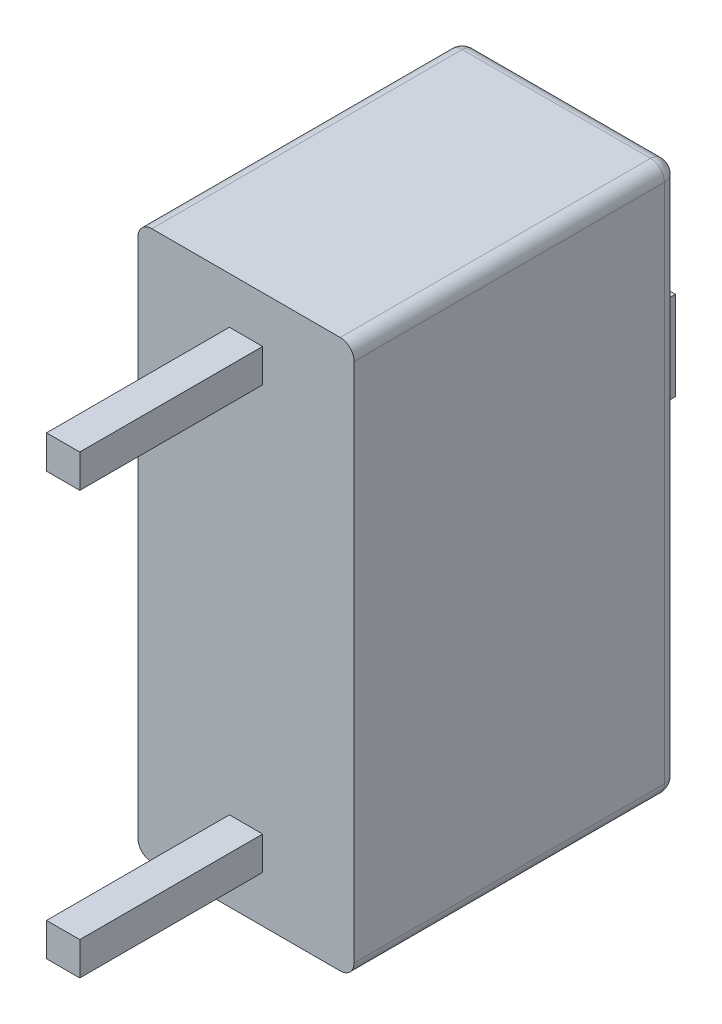
ISO-10303-21;
HEADER;
FILE_DESCRIPTION(('STEP AP214'),'2;1');
FILE_NAME('part.step','',(''),(''),'','','');
FILE_SCHEMA(('AUTOMOTIVE_DESIGN { 1 0 10303 214 1 1 1 1 }'));
ENDSEC;
DATA;
#1=APPLICATION_CONTEXT('core data for automotive mechanical design processes');
#2=APPLICATION_PROTOCOL_DEFINITION('international standard','automotive_design',2000,#1);
#3=PRODUCT_CONTEXT('',#1,'mechanical');
#4=PRODUCT('Part','Part','',(#3));
#5=PRODUCT_RELATED_PRODUCT_CATEGORY('part','',(#4));
#6=PRODUCT_DEFINITION_FORMATION('','',#4);
#7=PRODUCT_DEFINITION_CONTEXT('part definition',#1,'design');
#8=PRODUCT_DEFINITION('design','',#6,#7);
#9=PRODUCT_DEFINITION_SHAPE('','',#8);
#10=(LENGTH_UNIT() NAMED_UNIT(*) SI_UNIT(.MILLI.,.METRE.));
#11=(NAMED_UNIT(*) PLANE_ANGLE_UNIT() SI_UNIT($,.RADIAN.));
#12=(NAMED_UNIT(*) SI_UNIT($,.STERADIAN.) SOLID_ANGLE_UNIT());
#13=UNCERTAINTY_MEASURE_WITH_UNIT(LENGTH_MEASURE(1.E-05),#10,'distance_accuracy_value','');
#14=(GEOMETRIC_REPRESENTATION_CONTEXT(3) GLOBAL_UNCERTAINTY_ASSIGNED_CONTEXT((#13)) GLOBAL_UNIT_ASSIGNED_CONTEXT((#10,
#11,#12)) REPRESENTATION_CONTEXT('',''));
#15=CARTESIAN_POINT('',(0.,0.,0.));
#16=DIRECTION('',(0.,0.,1.));
#17=DIRECTION('',(1.,0.,0.));
#18=AXIS2_PLACEMENT_3D('',#15,#16,#17);
#19=CARTESIAN_POINT('',(-0.699999999999999,0.,0.1));
#20=DIRECTION('',(1.,0.,0.));
#21=DIRECTION('',(0.,0.,-1.));
#22=AXIS2_PLACEMENT_3D('',#19,#20,#21);
#23=PLANE('',#22);
#24=DIRECTION('',(0.,1.,0.));
#25=VECTOR('',#24,1.);
#26=CARTESIAN_POINT('',(-0.699999999999999,0.,1.));
#27=LINE('',#26,#25);
#28=CARTESIAN_POINT('',(-0.699999999999999,-1.6,1.));
#29=VERTEX_POINT('',#28);
#30=CARTESIAN_POINT('',(-0.699999999999999,0.,1.));
#31=VERTEX_POINT('',#30);
#32=EDGE_CURVE('E109',#29,#31,#27,.T.);
#33=ORIENTED_EDGE('',*,*,#32,.T.);
#34=DIRECTION('',(0.,0.,1.));
#35=VECTOR('',#34,1.);
#36=CARTESIAN_POINT('',(-0.699999999999999,0.,0.1));
#37=LINE('',#36,#35);
#38=CARTESIAN_POINT('',(-0.699999999999999,0.,0.1));
#39=VERTEX_POINT('',#38);
#40=EDGE_CURVE('E12',#39,#31,#37,.T.);
#41=ORIENTED_EDGE('',*,*,#40,.F.);
#42=DIRECTION('',(0.,1.,0.));
#43=VECTOR('',#42,1.);
#44=CARTESIAN_POINT('',(-0.699999999999999,0.,0.1));
#45=LINE('',#44,#43);
#46=CARTESIAN_POINT('',(-0.699999999999999,-1.6,0.1));
#47=VERTEX_POINT('',#46);
#48=EDGE_CURVE('E97',#47,#39,#45,.T.);
#49=ORIENTED_EDGE('',*,*,#48,.F.);
#50=DIRECTION('',(0.,0.,1.));
#51=VECTOR('',#50,1.);
#52=CARTESIAN_POINT('',(-0.699999999999999,-1.6,0.1));
#53=LINE('',#52,#51);
#54=EDGE_CURVE('E105',#47,#29,#53,.T.);
#55=ORIENTED_EDGE('',*,*,#54,.T.);
#56=EDGE_LOOP('',(#33,#41,#49,#55));
#57=FACE_BOUND('',#56,.T.);
#58=ADVANCED_FACE('F46',(#57),#23,.F.);
#59=CARTESIAN_POINT('',(-0.699999999999999,0.,0.1));
#60=DIRECTION('',(0.,-1.,0.));
#61=DIRECTION('',(0.,0.,-1.));
#62=AXIS2_PLACEMENT_3D('',#59,#60,#61);
#63=PLANE('',#62);
#64=DIRECTION('',(1.,0.,0.));
#65=VECTOR('',#64,1.);
#66=CARTESIAN_POINT('',(-0.699999999999999,0.,1.));
#67=LINE('',#66,#65);
#68=CARTESIAN_POINT('',(0.699999999999999,0.,1.));
#69=VERTEX_POINT('',#68);
#70=EDGE_CURVE('E101',#31,#69,#67,.T.);
#71=ORIENTED_EDGE('',*,*,#70,.T.);
#72=DIRECTION('',(0.,0.,1.));
#73=VECTOR('',#72,1.);
#74=CARTESIAN_POINT('',(0.699999999999999,0.,0.1));
#75=LINE('',#74,#73);
#76=CARTESIAN_POINT('',(0.699999999999999,0.,0.1));
#77=VERTEX_POINT('',#76);
#78=EDGE_CURVE('E54',#77,#69,#75,.T.);
#79=ORIENTED_EDGE('',*,*,#78,.F.);
#80=DIRECTION('',(1.,0.,0.));
#81=VECTOR('',#80,1.);
#82=CARTESIAN_POINT('',(-0.699999999999999,0.,0.1));
#83=LINE('',#82,#81);
#84=EDGE_CURVE('E92',#39,#77,#83,.T.);
#85=ORIENTED_EDGE('',*,*,#84,.F.);
#86=ORIENTED_EDGE('',*,*,#40,.T.);
#87=EDGE_LOOP('',(#71,#79,#85,#86));
#88=FACE_BOUND('',#87,.T.);
#89=ADVANCED_FACE('F100',(#88),#63,.F.);
#90=CARTESIAN_POINT('',(0.699999999999999,0.,0.1));
#91=DIRECTION('',(-1.,0.,0.));
#92=DIRECTION('',(0.,0.,1.));
#93=AXIS2_PLACEMENT_3D('',#90,#91,#92);
#94=PLANE('',#93);
#95=DIRECTION('',(0.,-1.,0.));
#96=VECTOR('',#95,1.);
#97=CARTESIAN_POINT('',(0.699999999999999,0.,1.));
#98=LINE('',#97,#96);
#99=CARTESIAN_POINT('',(0.699999999999999,-1.6,1.));
#100=VERTEX_POINT('',#99);
#101=EDGE_CURVE('E79',#69,#100,#98,.T.);
#102=ORIENTED_EDGE('',*,*,#101,.T.);
#103=DIRECTION('',(0.,0.,1.));
#104=VECTOR('',#103,1.);
#105=CARTESIAN_POINT('',(0.699999999999999,-1.6,0.1));
#106=LINE('',#105,#104);
#107=CARTESIAN_POINT('',(0.699999999999999,-1.6,0.1));
#108=VERTEX_POINT('',#107);
#109=EDGE_CURVE('E102',#108,#100,#106,.T.);
#110=ORIENTED_EDGE('',*,*,#109,.F.);
#111=DIRECTION('',(0.,-1.,0.));
#112=VECTOR('',#111,1.);
#113=CARTESIAN_POINT('',(0.699999999999999,0.,0.1));
#114=LINE('',#113,#112);
#115=EDGE_CURVE('E95',#77,#108,#114,.T.);
#116=ORIENTED_EDGE('',*,*,#115,.F.);
#117=ORIENTED_EDGE('',*,*,#78,.T.);
#118=EDGE_LOOP('',(#102,#110,#116,#117));
#119=FACE_BOUND('',#118,.T.);
#120=ADVANCED_FACE('F103',(#119),#94,.F.);
#121=CARTESIAN_POINT('',(-0.699999999999999,-1.6,0.1));
#122=DIRECTION('',(0.,1.,0.));
#123=DIRECTION('',(0.,0.,1.));
#124=AXIS2_PLACEMENT_3D('',#121,#122,#123);
#125=PLANE('',#124);
#126=DIRECTION('',(-1.,0.,0.));
#127=VECTOR('',#126,1.);
#128=CARTESIAN_POINT('',(-0.699999999999999,-1.6,1.));
#129=LINE('',#128,#127);
#130=EDGE_CURVE('E85',#100,#29,#129,.T.);
#131=ORIENTED_EDGE('',*,*,#130,.T.);
#132=ORIENTED_EDGE('',*,*,#54,.F.);
#133=DIRECTION('',(-1.,0.,0.));
#134=VECTOR('',#133,1.);
#135=CARTESIAN_POINT('',(-0.699999999999999,-1.6,0.1));
#136=LINE('',#135,#134);
#137=EDGE_CURVE('E62',#108,#47,#136,.T.);
#138=ORIENTED_EDGE('',*,*,#137,.F.);
#139=ORIENTED_EDGE('',*,*,#109,.T.);
#140=EDGE_LOOP('',(#131,#132,#138,#139));
#141=FACE_BOUND('',#140,.T.);
#142=ADVANCED_FACE('F116',(#141),#125,.F.);
#143=CARTESIAN_POINT('',(0.,0.,0.1));
#144=DIRECTION('',(0.,0.,1.));
#145=DIRECTION('',(1.,0.,0.));
#146=AXIS2_PLACEMENT_3D('',#143,#144,#145);
#147=PLANE('',#146);
#148=ORIENTED_EDGE('',*,*,#48,.T.);
#149=ORIENTED_EDGE('',*,*,#84,.T.);
#150=ORIENTED_EDGE('',*,*,#115,.T.);
#151=ORIENTED_EDGE('',*,*,#137,.T.);
#152=EDGE_LOOP('',(#148,#149,#150,#151));
#153=FACE_BOUND('',#152,.T.);
#154=ADVANCED_FACE('F93',(#153),#147,.F.);
#155=CARTESIAN_POINT('',(0.,0.,1.));
#156=DIRECTION('',(0.,0.,1.));
#157=DIRECTION('',(1.,0.,0.));
#158=AXIS2_PLACEMENT_3D('',#155,#156,#157);
#159=PLANE('',#158);
#160=ORIENTED_EDGE('',*,*,#32,.F.);
#161=ORIENTED_EDGE('',*,*,#130,.F.);
#162=ORIENTED_EDGE('',*,*,#101,.F.);
#163=ORIENTED_EDGE('',*,*,#70,.F.);
#164=EDGE_LOOP('',(#160,#161,#162,#163));
#165=FACE_BOUND('',#164,.T.);
#166=ADVANCED_FACE('F119',(#165),#159,.T.);
#167=CLOSED_SHELL('',(#58,#89,#120,#142,#154,#166));
#168=MANIFOLD_SOLID_BREP('B2',#167);
#169=CARTESIAN_POINT('',(0.699999999999999,1.6,-1.2));
#170=DIRECTION('',(0.,-1.,0.));
#171=DIRECTION('',(0.,0.,-1.));
#172=AXIS2_PLACEMENT_3D('',#169,#170,#171);
#173=PLANE('',#172);
#174=DIRECTION('',(1.,0.,0.));
#175=VECTOR('',#174,1.);
#176=CARTESIAN_POINT('',(0.699999999999999,1.6,1.));
#177=LINE('',#176,#175);
#178=CARTESIAN_POINT('',(-0.699999999999999,1.6,1.));
#179=VERTEX_POINT('',#178);
#180=CARTESIAN_POINT('',(0.699999999999999,1.6,1.));
#181=VERTEX_POINT('',#180);
#182=EDGE_CURVE('E244',#179,#181,#177,.T.);
#183=ORIENTED_EDGE('',*,*,#182,.T.);
#184=DIRECTION('',(0.,0.,1.));
#185=VECTOR('',#184,1.);
#186=CARTESIAN_POINT('',(0.699999999999999,1.6,-1.2));
#187=LINE('',#186,#185);
#188=CARTESIAN_POINT('',(0.699999999999999,1.6,-1.2));
#189=VERTEX_POINT('',#188);
#190=EDGE_CURVE('E44',#189,#181,#187,.T.);
#191=ORIENTED_EDGE('',*,*,#190,.F.);
#192=DIRECTION('',(1.,0.,0.));
#193=VECTOR('',#192,1.);
#194=CARTESIAN_POINT('',(0.699999999999999,1.6,-1.2));
#195=LINE('',#194,#193);
#196=CARTESIAN_POINT('',(-0.699999999999999,1.6,-1.2));
#197=VERTEX_POINT('',#196);
#198=EDGE_CURVE('E232',#197,#189,#195,.T.);
#199=ORIENTED_EDGE('',*,*,#198,.F.);
#200=DIRECTION('',(0.,0.,1.));
#201=VECTOR('',#200,1.);
#202=CARTESIAN_POINT('',(-0.699999999999999,1.6,-1.2));
#203=LINE('',#202,#201);
#204=EDGE_CURVE('E240',#197,#179,#203,.T.);
#205=ORIENTED_EDGE('',*,*,#204,.T.);
#206=EDGE_LOOP('',(#183,#191,#199,#205));
#207=FACE_BOUND('',#206,.T.);
#208=ADVANCED_FACE('F181',(#207),#173,.F.);
#209=CARTESIAN_POINT('',(0.699999999999999,0.,-1.2));
#210=DIRECTION('',(-1.,0.,0.));
#211=DIRECTION('',(0.,0.,1.));
#212=AXIS2_PLACEMENT_3D('',#209,#210,#211);
#213=PLANE('',#212);
#214=DIRECTION('',(0.,-1.,0.));
#215=VECTOR('',#214,1.);
#216=CARTESIAN_POINT('',(0.699999999999999,0.,1.));
#217=LINE('',#216,#215);
#218=CARTESIAN_POINT('',(0.699999999999999,0.,1.));
#219=VERTEX_POINT('',#218);
#220=EDGE_CURVE('E236',#181,#219,#217,.T.);
#221=ORIENTED_EDGE('',*,*,#220,.T.);
#222=DIRECTION('',(0.,0.,1.));
#223=VECTOR('',#222,1.);
#224=CARTESIAN_POINT('',(0.699999999999999,0.,-1.2));
#225=LINE('',#224,#223);
#226=CARTESIAN_POINT('',(0.699999999999999,0.,-1.2));
#227=VERTEX_POINT('',#226);
#228=EDGE_CURVE('E189',#227,#219,#225,.T.);
#229=ORIENTED_EDGE('',*,*,#228,.F.);
#230=DIRECTION('',(0.,-1.,0.));
#231=VECTOR('',#230,1.);
#232=CARTESIAN_POINT('',(0.699999999999999,0.,-1.2));
#233=LINE('',#232,#231);
#234=EDGE_CURVE('E227',#189,#227,#233,.T.);
#235=ORIENTED_EDGE('',*,*,#234,.F.);
#236=ORIENTED_EDGE('',*,*,#190,.T.);
#237=EDGE_LOOP('',(#221,#229,#235,#236));
#238=FACE_BOUND('',#237,.T.);
#239=ADVANCED_FACE('F235',(#238),#213,.F.);
#240=CARTESIAN_POINT('',(-0.699999999999999,0.,-1.2));
#241=DIRECTION('',(0.,1.,0.));
#242=DIRECTION('',(0.,0.,1.));
#243=AXIS2_PLACEMENT_3D('',#240,#241,#242);
#244=PLANE('',#243);
#245=DIRECTION('',(-1.,0.,0.));
#246=VECTOR('',#245,1.);
#247=CARTESIAN_POINT('',(-0.699999999999999,0.,1.));
#248=LINE('',#247,#246);
#249=CARTESIAN_POINT('',(-0.699999999999999,0.,1.));
#250=VERTEX_POINT('',#249);
#251=EDGE_CURVE('E214',#219,#250,#248,.T.);
#252=ORIENTED_EDGE('',*,*,#251,.T.);
#253=DIRECTION('',(0.,0.,1.));
#254=VECTOR('',#253,1.);
#255=CARTESIAN_POINT('',(-0.699999999999999,0.,-1.2));
#256=LINE('',#255,#254);
#257=CARTESIAN_POINT('',(-0.699999999999999,0.,-1.2));
#258=VERTEX_POINT('',#257);
#259=EDGE_CURVE('E237',#258,#250,#256,.T.);
#260=ORIENTED_EDGE('',*,*,#259,.F.);
#261=DIRECTION('',(-1.,0.,0.));
#262=VECTOR('',#261,1.);
#263=CARTESIAN_POINT('',(-0.699999999999999,0.,-1.2));
#264=LINE('',#263,#262);
#265=EDGE_CURVE('E230',#227,#258,#264,.T.);
#266=ORIENTED_EDGE('',*,*,#265,.F.);
#267=ORIENTED_EDGE('',*,*,#228,.T.);
#268=EDGE_LOOP('',(#252,#260,#266,#267));
#269=FACE_BOUND('',#268,.T.);
#270=ADVANCED_FACE('F238',(#269),#244,.F.);
#271=CARTESIAN_POINT('',(-0.699999999999999,1.6,-1.2));
#272=DIRECTION('',(1.,0.,0.));
#273=DIRECTION('',(0.,0.,-1.));
#274=AXIS2_PLACEMENT_3D('',#271,#272,#273);
#275=PLANE('',#274);
#276=DIRECTION('',(0.,1.,0.));
#277=VECTOR('',#276,1.);
#278=CARTESIAN_POINT('',(-0.699999999999999,1.6,1.));
#279=LINE('',#278,#277);
#280=EDGE_CURVE('E220',#250,#179,#279,.T.);
#281=ORIENTED_EDGE('',*,*,#280,.T.);
#282=ORIENTED_EDGE('',*,*,#204,.F.);
#283=DIRECTION('',(0.,1.,0.));
#284=VECTOR('',#283,1.);
#285=CARTESIAN_POINT('',(-0.699999999999999,1.6,-1.2));
#286=LINE('',#285,#284);
#287=EDGE_CURVE('E197',#258,#197,#286,.T.);
#288=ORIENTED_EDGE('',*,*,#287,.F.);
#289=ORIENTED_EDGE('',*,*,#259,.T.);
#290=EDGE_LOOP('',(#281,#282,#288,#289));
#291=FACE_BOUND('',#290,.T.);
#292=ADVANCED_FACE('F251',(#291),#275,.F.);
#293=CARTESIAN_POINT('',(0.,0.,-1.2));
#294=DIRECTION('',(0.,0.,1.));
#295=DIRECTION('',(1.,0.,0.));
#296=AXIS2_PLACEMENT_3D('',#293,#294,#295);
#297=PLANE('',#296);
#298=ORIENTED_EDGE('',*,*,#198,.T.);
#299=ORIENTED_EDGE('',*,*,#234,.T.);
#300=ORIENTED_EDGE('',*,*,#265,.T.);
#301=ORIENTED_EDGE('',*,*,#287,.T.);
#302=EDGE_LOOP('',(#298,#299,#300,#301));
#303=FACE_BOUND('',#302,.T.);
#304=ADVANCED_FACE('F228',(#303),#297,.F.);
#305=CARTESIAN_POINT('',(0.,0.,1.));
#306=DIRECTION('',(0.,0.,1.));
#307=DIRECTION('',(1.,0.,0.));
#308=AXIS2_PLACEMENT_3D('',#305,#306,#307);
#309=PLANE('',#308);
#310=ORIENTED_EDGE('',*,*,#182,.F.);
#311=ORIENTED_EDGE('',*,*,#280,.F.);
#312=ORIENTED_EDGE('',*,*,#251,.F.);
#313=ORIENTED_EDGE('',*,*,#220,.F.);
#314=EDGE_LOOP('',(#310,#311,#312,#313));
#315=FACE_BOUND('',#314,.T.);
#316=ADVANCED_FACE('F254',(#315),#309,.T.);
#317=CLOSED_SHELL('',(#208,#239,#270,#292,#304,#316));
#318=MANIFOLD_SOLID_BREP('B6',#317);
#319=CARTESIAN_POINT('',(0.,0.,5.85));
#320=DIRECTION('',(0.,0.,1.));
#321=DIRECTION('',(1.,0.,0.));
#322=AXIS2_PLACEMENT_3D('',#319,#320,#321);
#323=PLANE('',#322);
#324=DIRECTION('',(0.,1.,0.));
#325=VECTOR('',#324,1.);
#326=CARTESIAN_POINT('',(1.95,4.95,5.85));
#327=LINE('',#326,#325);
#328=CARTESIAN_POINT('',(1.95,-4.69999999999999,5.85));
#329=VERTEX_POINT('',#328);
#330=CARTESIAN_POINT('',(1.95,4.7,5.85));
#331=VERTEX_POINT('',#330);
#332=EDGE_CURVE('E550',#329,#331,#327,.T.);
#333=ORIENTED_EDGE('',*,*,#332,.T.);
#334=CARTESIAN_POINT('',(1.7,4.7,5.85));
#335=DIRECTION('',(0.,0.,1.));
#336=DIRECTION('',(1.,0.,0.));
#337=AXIS2_PLACEMENT_3D('',#334,#335,#336);
#338=CIRCLE('',#337,0.25);
#339=CARTESIAN_POINT('',(1.7,4.95,5.85));
#340=VERTEX_POINT('',#339);
#341=EDGE_CURVE('E587',#331,#340,#338,.T.);
#342=ORIENTED_EDGE('',*,*,#341,.T.);
#343=DIRECTION('',(-1.,0.,0.));
#344=VECTOR('',#343,1.);
#345=CARTESIAN_POINT('',(-1.95,4.95,5.85));
#346=LINE('',#345,#344);
#347=CARTESIAN_POINT('',(-1.7,4.95,5.85));
#348=VERTEX_POINT('',#347);
#349=EDGE_CURVE('E559',#340,#348,#346,.T.);
#350=ORIENTED_EDGE('',*,*,#349,.T.);
#351=CARTESIAN_POINT('',(-1.7,4.7,5.85));
#352=DIRECTION('',(0.,0.,1.));
#353=DIRECTION('',(1.,0.,0.));
#354=AXIS2_PLACEMENT_3D('',#351,#352,#353);
#355=CIRCLE('',#354,0.25);
#356=CARTESIAN_POINT('',(-1.95,4.7,5.85));
#357=VERTEX_POINT('',#356);
#358=EDGE_CURVE('E585',#348,#357,#355,.T.);
#359=ORIENTED_EDGE('',*,*,#358,.T.);
#360=DIRECTION('',(0.,-1.,0.));
#361=VECTOR('',#360,1.);
#362=CARTESIAN_POINT('',(-1.95,4.95,5.85));
#363=LINE('',#362,#361);
#364=CARTESIAN_POINT('',(-1.95,-4.69999999999999,5.85));
#365=VERTEX_POINT('',#364);
#366=EDGE_CURVE('E562',#357,#365,#363,.T.);
#367=ORIENTED_EDGE('',*,*,#366,.T.);
#368=CARTESIAN_POINT('',(-1.7,-4.7,5.85));
#369=DIRECTION('',(0.,0.,1.));
#370=DIRECTION('',(1.,0.,0.));
#371=AXIS2_PLACEMENT_3D('',#368,#369,#370);
#372=CIRCLE('',#371,0.25);
#373=CARTESIAN_POINT('',(-1.7,-4.95,5.85));
#374=VERTEX_POINT('',#373);
#375=EDGE_CURVE('E581',#365,#374,#372,.T.);
#376=ORIENTED_EDGE('',*,*,#375,.T.);
#377=DIRECTION('',(1.,0.,0.));
#378=VECTOR('',#377,1.);
#379=CARTESIAN_POINT('',(-1.95,-4.95,5.85));
#380=LINE('',#379,#378);
#381=CARTESIAN_POINT('',(1.7,-4.95,5.85));
#382=VERTEX_POINT('',#381);
#383=EDGE_CURVE('E565',#374,#382,#380,.T.);
#384=ORIENTED_EDGE('',*,*,#383,.T.);
#385=CARTESIAN_POINT('',(1.7,-4.7,5.85));
#386=DIRECTION('',(0.,0.,1.));
#387=DIRECTION('',(1.,0.,0.));
#388=AXIS2_PLACEMENT_3D('',#385,#386,#387);
#389=CIRCLE('',#388,0.25);
#390=EDGE_CURVE('E583',#382,#329,#389,.T.);
#391=ORIENTED_EDGE('',*,*,#390,.T.);
#392=EDGE_LOOP('',(#333,#342,#350,#359,#367,#376,#384,#391));
#393=FACE_BOUND('',#392,.T.);
#394=DIRECTION('',(1.,0.,0.));
#395=VECTOR('',#394,1.);
#396=CARTESIAN_POINT('',(0.299999999999998,3.51,5.85));
#397=LINE('',#396,#395);
#398=CARTESIAN_POINT('',(-0.300000000000002,3.51,5.85));
#399=VERTEX_POINT('',#398);
#400=CARTESIAN_POINT('',(0.299999999999998,3.51,5.85));
#401=VERTEX_POINT('',#400);
#402=EDGE_CURVE('E495',#399,#401,#397,.T.);
#403=ORIENTED_EDGE('',*,*,#402,.F.);
#404=DIRECTION('',(0.,-1.,0.));
#405=VECTOR('',#404,1.);
#406=CARTESIAN_POINT('',(-0.300000000000002,4.11,5.85));
#407=LINE('',#406,#405);
#408=CARTESIAN_POINT('',(-0.300000000000002,4.11,5.85));
#409=VERTEX_POINT('',#408);
#410=EDGE_CURVE('E492',#409,#399,#407,.T.);
#411=ORIENTED_EDGE('',*,*,#410,.F.);
#412=DIRECTION('',(-1.,0.,0.));
#413=VECTOR('',#412,1.);
#414=CARTESIAN_POINT('',(0.299999999999998,4.11,5.85));
#415=LINE('',#414,#413);
#416=CARTESIAN_POINT('',(0.299999999999998,4.11,5.85));
#417=VERTEX_POINT('',#416);
#418=EDGE_CURVE('E504',#417,#409,#415,.T.);
#419=ORIENTED_EDGE('',*,*,#418,.F.);
#420=DIRECTION('',(0.,1.,0.));
#421=VECTOR('',#420,1.);
#422=CARTESIAN_POINT('',(0.299999999999998,4.11,5.85));
#423=LINE('',#422,#421);
#424=EDGE_CURVE('E512',#401,#417,#423,.T.);
#425=ORIENTED_EDGE('',*,*,#424,.F.);
#426=EDGE_LOOP('',(#403,#411,#419,#425));
#427=FACE_BOUND('',#426,.T.);
#428=DIRECTION('',(1.,0.,0.));
#429=VECTOR('',#428,1.);
#430=CARTESIAN_POINT('',(0.300000000000001,-4.11,5.85));
#431=LINE('',#430,#429);
#432=CARTESIAN_POINT('',(-0.299999999999999,-4.11,5.85));
#433=VERTEX_POINT('',#432);
#434=CARTESIAN_POINT('',(0.300000000000001,-4.11,5.85));
#435=VERTEX_POINT('',#434);
#436=EDGE_CURVE('E1018',#433,#435,#431,.T.);
#437=ORIENTED_EDGE('',*,*,#436,.F.);
#438=DIRECTION('',(0.,-1.,0.));
#439=VECTOR('',#438,1.);
#440=CARTESIAN_POINT('',(-0.299999999999999,-3.51,5.85));
#441=LINE('',#440,#439);
#442=CARTESIAN_POINT('',(-0.299999999999999,-3.51,5.85));
#443=VERTEX_POINT('',#442);
#444=EDGE_CURVE('E490',#443,#433,#441,.T.);
#445=ORIENTED_EDGE('',*,*,#444,.F.);
#446=DIRECTION('',(-1.,0.,0.));
#447=VECTOR('',#446,1.);
#448=CARTESIAN_POINT('',(0.3,-3.51,5.85));
#449=LINE('',#448,#447);
#450=CARTESIAN_POINT('',(0.3,-3.51,5.85));
#451=VERTEX_POINT('',#450);
#452=EDGE_CURVE('E486',#451,#443,#449,.T.);
#453=ORIENTED_EDGE('',*,*,#452,.F.);
#454=DIRECTION('',(0.,1.,0.));
#455=VECTOR('',#454,1.);
#456=CARTESIAN_POINT('',(0.3,-3.51,5.85));
#457=LINE('',#456,#455);
#458=EDGE_CURVE('E1015',#435,#451,#457,.T.);
#459=ORIENTED_EDGE('',*,*,#458,.F.);
#460=EDGE_LOOP('',(#437,#445,#453,#459));
#461=FACE_BOUND('',#460,.T.);
#462=ADVANCED_FACE('F315',(#393,#427,#461),#323,.T.);
#463=CARTESIAN_POINT('',(1.95,4.95,5.85));
#464=DIRECTION('',(-1.,0.,0.));
#465=DIRECTION('',(0.,-1.,0.));
#466=AXIS2_PLACEMENT_3D('',#463,#464,#465);
#467=PLANE('',#466);
#468=DIRECTION('',(0.,1.,0.));
#469=VECTOR('',#468,1.);
#470=CARTESIAN_POINT('',(1.95,4.95,0.25));
#471=LINE('',#470,#469);
#472=CARTESIAN_POINT('',(1.95,-4.7,0.25));
#473=VERTEX_POINT('',#472);
#474=CARTESIAN_POINT('',(1.95,4.7,0.25));
#475=VERTEX_POINT('',#474);
#476=EDGE_CURVE('E575',#473,#475,#471,.T.);
#477=ORIENTED_EDGE('',*,*,#476,.T.);
#478=DIRECTION('',(0.,0.,-1.));
#479=VECTOR('',#478,1.);
#480=CARTESIAN_POINT('',(1.95,4.7,5.85));
#481=LINE('',#480,#479);
#482=EDGE_CURVE('E579',#475,#331,#481,.F.);
#483=ORIENTED_EDGE('',*,*,#482,.T.);
#484=ORIENTED_EDGE('',*,*,#332,.F.);
#485=DIRECTION('',(0.,0.,-1.));
#486=VECTOR('',#485,1.);
#487=CARTESIAN_POINT('',(1.95,-4.7,5.85));
#488=LINE('',#487,#486);
#489=EDGE_CURVE('E577',#329,#473,#488,.T.);
#490=ORIENTED_EDGE('',*,*,#489,.T.);
#491=EDGE_LOOP('',(#477,#483,#484,#490));
#492=FACE_BOUND('',#491,.T.);
#493=ADVANCED_FACE('F698',(#492),#467,.F.);
#494=CARTESIAN_POINT('',(-1.95,4.95,5.85));
#495=DIRECTION('',(0.,-1.,0.));
#496=DIRECTION('',(0.,0.,-1.));
#497=AXIS2_PLACEMENT_3D('',#494,#495,#496);
#498=PLANE('',#497);
#499=ORIENTED_EDGE('',*,*,#349,.F.);
#500=DIRECTION('',(0.,0.,-1.));
#501=VECTOR('',#500,1.);
#502=CARTESIAN_POINT('',(1.7,4.95,5.85));
#503=LINE('',#502,#501);
#504=CARTESIAN_POINT('',(1.7,4.95,0.25));
#505=VERTEX_POINT('',#504);
#506=EDGE_CURVE('E572',#340,#505,#503,.T.);
#507=ORIENTED_EDGE('',*,*,#506,.T.);
#508=DIRECTION('',(-1.,0.,0.));
#509=VECTOR('',#508,1.);
#510=CARTESIAN_POINT('',(-1.95,4.95,0.25));
#511=LINE('',#510,#509);
#512=CARTESIAN_POINT('',(-1.7,4.95,0.25));
#513=VERTEX_POINT('',#512);
#514=EDGE_CURVE('E568',#505,#513,#511,.T.);
#515=ORIENTED_EDGE('',*,*,#514,.T.);
#516=DIRECTION('',(0.,0.,-1.));
#517=VECTOR('',#516,1.);
#518=CARTESIAN_POINT('',(-1.7,4.95,5.85));
#519=LINE('',#518,#517);
#520=EDGE_CURVE('E570',#513,#348,#519,.F.);
#521=ORIENTED_EDGE('',*,*,#520,.T.);
#522=EDGE_LOOP('',(#499,#507,#515,#521));
#523=FACE_BOUND('',#522,.T.);
#524=ADVANCED_FACE('F706',(#523),#498,.F.);
#525=CARTESIAN_POINT('',(-1.95,4.95,5.85));
#526=DIRECTION('',(1.,0.,0.));
#527=DIRECTION('',(0.,1.,0.));
#528=AXIS2_PLACEMENT_3D('',#525,#526,#527);
#529=PLANE('',#528);
#530=ORIENTED_EDGE('',*,*,#366,.F.);
#531=DIRECTION('',(0.,0.,-1.));
#532=VECTOR('',#531,1.);
#533=CARTESIAN_POINT('',(-1.95,4.7,5.85));
#534=LINE('',#533,#532);
#535=CARTESIAN_POINT('',(-1.95,4.7,0.25));
#536=VERTEX_POINT('',#535);
#537=EDGE_CURVE('E593',#357,#536,#534,.T.);
#538=ORIENTED_EDGE('',*,*,#537,.T.);
#539=DIRECTION('',(0.,-1.,0.));
#540=VECTOR('',#539,1.);
#541=CARTESIAN_POINT('',(-1.95,4.95,0.25));
#542=LINE('',#541,#540);
#543=CARTESIAN_POINT('',(-1.95,-4.7,0.25));
#544=VERTEX_POINT('',#543);
#545=EDGE_CURVE('E589',#536,#544,#542,.T.);
#546=ORIENTED_EDGE('',*,*,#545,.T.);
#547=DIRECTION('',(0.,0.,-1.));
#548=VECTOR('',#547,1.);
#549=CARTESIAN_POINT('',(-1.95,-4.7,5.85));
#550=LINE('',#549,#548);
#551=EDGE_CURVE('E591',#544,#365,#550,.F.);
#552=ORIENTED_EDGE('',*,*,#551,.T.);
#553=EDGE_LOOP('',(#530,#538,#546,#552));
#554=FACE_BOUND('',#553,.T.);
#555=ADVANCED_FACE('F650',(#554),#529,.F.);
#556=CARTESIAN_POINT('',(-1.95,-4.95,5.85));
#557=DIRECTION('',(0.,1.,0.));
#558=DIRECTION('',(0.,0.,1.));
#559=AXIS2_PLACEMENT_3D('',#556,#557,#558);
#560=PLANE('',#559);
#561=DIRECTION('',(1.,0.,0.));
#562=VECTOR('',#561,1.);
#563=CARTESIAN_POINT('',(-1.95,-4.95,0.25));
#564=LINE('',#563,#562);
#565=CARTESIAN_POINT('',(-1.7,-4.95,0.25));
#566=VERTEX_POINT('',#565);
#567=CARTESIAN_POINT('',(1.7,-4.95,0.25));
#568=VERTEX_POINT('',#567);
#569=EDGE_CURVE('E595',#566,#568,#564,.T.);
#570=ORIENTED_EDGE('',*,*,#569,.T.);
#571=DIRECTION('',(0.,0.,-1.));
#572=VECTOR('',#571,1.);
#573=CARTESIAN_POINT('',(1.7,-4.95,5.85));
#574=LINE('',#573,#572);
#575=EDGE_CURVE('E599',#568,#382,#574,.F.);
#576=ORIENTED_EDGE('',*,*,#575,.T.);
#577=ORIENTED_EDGE('',*,*,#383,.F.);
#578=DIRECTION('',(0.,0.,-1.));
#579=VECTOR('',#578,1.);
#580=CARTESIAN_POINT('',(-1.7,-4.95,5.85));
#581=LINE('',#580,#579);
#582=EDGE_CURVE('E597',#374,#566,#581,.T.);
#583=ORIENTED_EDGE('',*,*,#582,.T.);
#584=EDGE_LOOP('',(#570,#576,#577,#583));
#585=FACE_BOUND('',#584,.T.);
#586=ADVANCED_FACE('F690',(#585),#560,.F.);
#587=CARTESIAN_POINT('',(0.,0.,0.));
#588=DIRECTION('',(0.,0.,1.));
#589=DIRECTION('',(1.,0.,0.));
#590=AXIS2_PLACEMENT_3D('',#587,#588,#589);
#591=PLANE('',#590);
#592=DIRECTION('',(0.,1.,0.));
#593=VECTOR('',#592,1.);
#594=CARTESIAN_POINT('',(1.7,0.,0.));
#595=LINE('',#594,#593);
#596=CARTESIAN_POINT('',(1.7,4.7,0.));
#597=VERTEX_POINT('',#596);
#598=CARTESIAN_POINT('',(1.7,-4.7,0.));
#599=VERTEX_POINT('',#598);
#600=EDGE_CURVE('E601',#597,#599,#595,.F.);
#601=ORIENTED_EDGE('',*,*,#600,.T.);
#602=DIRECTION('',(1.,0.,0.));
#603=VECTOR('',#602,1.);
#604=CARTESIAN_POINT('',(0.,-4.7,0.));
#605=LINE('',#604,#603);
#606=CARTESIAN_POINT('',(-1.7,-4.7,0.));
#607=VERTEX_POINT('',#606);
#608=EDGE_CURVE('E179',#599,#607,#605,.F.);
#609=ORIENTED_EDGE('',*,*,#608,.T.);
#610=DIRECTION('',(0.,-1.,0.));
#611=VECTOR('',#610,1.);
#612=CARTESIAN_POINT('',(-1.7,0.,0.));
#613=LINE('',#612,#611);
#614=CARTESIAN_POINT('',(-1.7,4.7,0.));
#615=VERTEX_POINT('',#614);
#616=EDGE_CURVE('E324',#607,#615,#613,.F.);
#617=ORIENTED_EDGE('',*,*,#616,.T.);
#618=DIRECTION('',(-1.,0.,0.));
#619=VECTOR('',#618,1.);
#620=CARTESIAN_POINT('',(0.,4.7,0.));
#621=LINE('',#620,#619);
#622=EDGE_CURVE('E603',#615,#597,#621,.F.);
#623=ORIENTED_EDGE('',*,*,#622,.T.);
#624=EDGE_LOOP('',(#601,#609,#617,#623));
#625=FACE_BOUND('',#624,.T.);
#626=DIRECTION('',(1.,0.,0.));
#627=VECTOR('',#626,1.);
#628=CARTESIAN_POINT('',(0.699999999999999,1.6,0.));
#629=LINE('',#628,#627);
#630=CARTESIAN_POINT('',(-0.699999999999999,1.6,0.));
#631=VERTEX_POINT('',#630);
#632=CARTESIAN_POINT('',(0.699999999999999,1.6,0.));
#633=VERTEX_POINT('',#632);
#634=EDGE_CURVE('E540',#631,#633,#629,.T.);
#635=ORIENTED_EDGE('',*,*,#634,.F.);
#636=DIRECTION('',(0.,1.,0.));
#637=VECTOR('',#636,1.);
#638=CARTESIAN_POINT('',(-0.699999999999999,1.6,0.));
#639=LINE('',#638,#637);
#640=CARTESIAN_POINT('',(-0.699999999999999,-1.6,0.));
#641=VERTEX_POINT('',#640);
#642=EDGE_CURVE('E538',#641,#631,#639,.T.);
#643=ORIENTED_EDGE('',*,*,#642,.F.);
#644=DIRECTION('',(-1.,0.,0.));
#645=VECTOR('',#644,1.);
#646=CARTESIAN_POINT('',(0.699999999999999,-1.6,0.));
#647=LINE('',#646,#645);
#648=CARTESIAN_POINT('',(0.699999999999999,-1.6,0.));
#649=VERTEX_POINT('',#648);
#650=EDGE_CURVE('E528',#649,#641,#647,.T.);
#651=ORIENTED_EDGE('',*,*,#650,.F.);
#652=DIRECTION('',(0.,-1.,0.));
#653=VECTOR('',#652,1.);
#654=CARTESIAN_POINT('',(0.699999999999999,1.6,0.));
#655=LINE('',#654,#653);
#656=EDGE_CURVE('E543',#633,#649,#655,.T.);
#657=ORIENTED_EDGE('',*,*,#656,.F.);
#658=EDGE_LOOP('',(#635,#643,#651,#657));
#659=FACE_BOUND('',#658,.T.);
#660=ADVANCED_FACE('F673',(#625,#659),#591,.F.);
#661=CARTESIAN_POINT('',(-0.699999999999999,1.6,1.));
#662=DIRECTION('',(-1.,0.,0.));
#663=DIRECTION('',(0.,0.,1.));
#664=AXIS2_PLACEMENT_3D('',#661,#662,#663);
#665=PLANE('',#664);
#666=ORIENTED_EDGE('',*,*,#642,.T.);
#667=DIRECTION('',(0.,0.,-1.));
#668=VECTOR('',#667,1.);
#669=CARTESIAN_POINT('',(-0.699999999999999,1.6,1.));
#670=LINE('',#669,#668);
#671=CARTESIAN_POINT('',(-0.699999999999999,1.6,1.));
#672=VERTEX_POINT('',#671);
#673=EDGE_CURVE('E537',#672,#631,#670,.T.);
#674=ORIENTED_EDGE('',*,*,#673,.F.);
#675=DIRECTION('',(0.,1.,0.));
#676=VECTOR('',#675,1.);
#677=CARTESIAN_POINT('',(-0.699999999999999,1.6,1.));
#678=LINE('',#677,#676);
#679=CARTESIAN_POINT('',(-0.699999999999999,-1.6,1.));
#680=VERTEX_POINT('',#679);
#681=EDGE_CURVE('E524',#680,#672,#678,.T.);
#682=ORIENTED_EDGE('',*,*,#681,.F.);
#683=DIRECTION('',(0.,0.,-1.));
#684=VECTOR('',#683,1.);
#685=CARTESIAN_POINT('',(-0.699999999999999,-1.6,1.));
#686=LINE('',#685,#684);
#687=EDGE_CURVE('E548',#680,#641,#686,.T.);
#688=ORIENTED_EDGE('',*,*,#687,.T.);
#689=EDGE_LOOP('',(#666,#674,#682,#688));
#690=FACE_BOUND('',#689,.T.);
#691=ADVANCED_FACE('F721',(#690),#665,.F.);
#692=CARTESIAN_POINT('',(0.699999999999999,-1.6,1.));
#693=DIRECTION('',(0.,-1.,0.));
#694=DIRECTION('',(0.,0.,-1.));
#695=AXIS2_PLACEMENT_3D('',#692,#693,#694);
#696=PLANE('',#695);
#697=ORIENTED_EDGE('',*,*,#650,.T.);
#698=ORIENTED_EDGE('',*,*,#687,.F.);
#699=DIRECTION('',(-1.,0.,0.));
#700=VECTOR('',#699,1.);
#701=CARTESIAN_POINT('',(0.699999999999999,-1.6,1.));
#702=LINE('',#701,#700);
#703=CARTESIAN_POINT('',(0.699999999999999,-1.6,1.));
#704=VERTEX_POINT('',#703);
#705=EDGE_CURVE('E534',#704,#680,#702,.T.);
#706=ORIENTED_EDGE('',*,*,#705,.F.);
#707=DIRECTION('',(0.,0.,-1.));
#708=VECTOR('',#707,1.);
#709=CARTESIAN_POINT('',(0.699999999999999,-1.6,1.));
#710=LINE('',#709,#708);
#711=EDGE_CURVE('E551',#704,#649,#710,.T.);
#712=ORIENTED_EDGE('',*,*,#711,.T.);
#713=EDGE_LOOP('',(#697,#698,#706,#712));
#714=FACE_BOUND('',#713,.T.);
#715=ADVANCED_FACE('F741',(#714),#696,.F.);
#716=CARTESIAN_POINT('',(0.699999999999999,1.6,1.));
#717=DIRECTION('',(1.,0.,0.));
#718=DIRECTION('',(0.,0.,-1.));
#719=AXIS2_PLACEMENT_3D('',#716,#717,#718);
#720=PLANE('',#719);
#721=ORIENTED_EDGE('',*,*,#656,.T.);
#722=ORIENTED_EDGE('',*,*,#711,.F.);
#723=DIRECTION('',(0.,-1.,0.));
#724=VECTOR('',#723,1.);
#725=CARTESIAN_POINT('',(0.699999999999999,1.6,1.));
#726=LINE('',#725,#724);
#727=CARTESIAN_POINT('',(0.699999999999999,1.6,1.));
#728=VERTEX_POINT('',#727);
#729=EDGE_CURVE('E531',#728,#704,#726,.T.);
#730=ORIENTED_EDGE('',*,*,#729,.F.);
#731=DIRECTION('',(0.,0.,-1.));
#732=VECTOR('',#731,1.);
#733=CARTESIAN_POINT('',(0.699999999999999,1.6,1.));
#734=LINE('',#733,#732);
#735=EDGE_CURVE('E553',#728,#633,#734,.T.);
#736=ORIENTED_EDGE('',*,*,#735,.T.);
#737=EDGE_LOOP('',(#721,#722,#730,#736));
#738=FACE_BOUND('',#737,.T.);
#739=ADVANCED_FACE('F748',(#738),#720,.F.);
#740=CARTESIAN_POINT('',(0.699999999999999,1.6,1.));
#741=DIRECTION('',(0.,1.,0.));
#742=DIRECTION('',(0.,0.,1.));
#743=AXIS2_PLACEMENT_3D('',#740,#741,#742);
#744=PLANE('',#743);
#745=ORIENTED_EDGE('',*,*,#634,.T.);
#746=ORIENTED_EDGE('',*,*,#735,.F.);
#747=DIRECTION('',(1.,0.,0.));
#748=VECTOR('',#747,1.);
#749=CARTESIAN_POINT('',(0.699999999999999,1.6,1.));
#750=LINE('',#749,#748);
#751=EDGE_CURVE('E527',#672,#728,#750,.T.);
#752=ORIENTED_EDGE('',*,*,#751,.F.);
#753=ORIENTED_EDGE('',*,*,#673,.T.);
#754=EDGE_LOOP('',(#745,#746,#752,#753));
#755=FACE_BOUND('',#754,.T.);
#756=ADVANCED_FACE('F756',(#755),#744,.F.);
#757=CARTESIAN_POINT('',(0.,0.,1.));
#758=DIRECTION('',(0.,0.,-1.));
#759=DIRECTION('',(-1.,0.,0.));
#760=AXIS2_PLACEMENT_3D('',#757,#758,#759);
#761=PLANE('',#760);
#762=ORIENTED_EDGE('',*,*,#681,.T.);
#763=ORIENTED_EDGE('',*,*,#751,.T.);
#764=ORIENTED_EDGE('',*,*,#729,.T.);
#765=ORIENTED_EDGE('',*,*,#705,.T.);
#766=EDGE_LOOP('',(#762,#763,#764,#765));
#767=FACE_BOUND('',#766,.T.);
#768=ADVANCED_FACE('F764',(#767),#761,.T.);
#769=CARTESIAN_POINT('',(-1.7,-4.7,5.85));
#770=DIRECTION('',(0.,0.,-1.));
#771=DIRECTION('',(-1.,0.,0.));
#772=AXIS2_PLACEMENT_3D('',#769,#770,#771);
#773=CYLINDRICAL_SURFACE('',#772,0.25);
#774=CARTESIAN_POINT('',(-1.7,-4.7,0.25));
#775=DIRECTION('',(0.,0.,-1.));
#776=DIRECTION('',(-1.,0.,0.));
#777=AXIS2_PLACEMENT_3D('',#774,#775,#776);
#778=CIRCLE('',#777,0.25);
#779=EDGE_CURVE('E319',#566,#544,#778,.T.);
#780=ORIENTED_EDGE('',*,*,#779,.F.);
#781=ORIENTED_EDGE('',*,*,#582,.F.);
#782=ORIENTED_EDGE('',*,*,#375,.F.);
#783=ORIENTED_EDGE('',*,*,#551,.F.);
#784=EDGE_LOOP('',(#780,#781,#782,#783));
#785=FACE_BOUND('',#784,.T.);
#786=ADVANCED_FACE('F317',(#785),#773,.T.);
#787=CARTESIAN_POINT('',(-1.7,-4.7,0.25));
#788=DIRECTION('',(0.,0.,1.));
#789=DIRECTION('',(1.,0.,0.));
#790=AXIS2_PLACEMENT_3D('',#787,#788,#789);
#791=SPHERICAL_SURFACE('',#790,0.25);
#792=CARTESIAN_POINT('',(-1.7,-4.7,0.25));
#793=DIRECTION('',(-1.,0.,0.));
#794=DIRECTION('',(0.,0.,1.));
#795=AXIS2_PLACEMENT_3D('',#792,#793,#794);
#796=CIRCLE('',#795,0.25);
#797=EDGE_CURVE('E631',#566,#607,#796,.F.);
#798=ORIENTED_EDGE('',*,*,#797,.F.);
#799=ORIENTED_EDGE('',*,*,#779,.T.);
#800=CARTESIAN_POINT('',(-1.7,-4.7,0.25));
#801=DIRECTION('',(0.,-1.,0.));
#802=DIRECTION('',(0.,0.,-1.));
#803=AXIS2_PLACEMENT_3D('',#800,#801,#802);
#804=CIRCLE('',#803,0.25);
#805=EDGE_CURVE('E633',#607,#544,#804,.F.);
#806=ORIENTED_EDGE('',*,*,#805,.F.);
#807=EDGE_LOOP('',(#798,#799,#806));
#808=FACE_BOUND('',#807,.T.);
#809=ADVANCED_FACE('F642',(#808),#791,.T.);
#810=CARTESIAN_POINT('',(-1.7,4.7,5.85));
#811=DIRECTION('',(0.,0.,-1.));
#812=DIRECTION('',(-1.,0.,0.));
#813=AXIS2_PLACEMENT_3D('',#810,#811,#812);
#814=CYLINDRICAL_SURFACE('',#813,0.25);
#815=ORIENTED_EDGE('',*,*,#358,.F.);
#816=ORIENTED_EDGE('',*,*,#520,.F.);
#817=CARTESIAN_POINT('',(-1.7,4.7,0.25));
#818=DIRECTION('',(0.,0.,-1.));
#819=DIRECTION('',(-1.,0.,0.));
#820=AXIS2_PLACEMENT_3D('',#817,#818,#819);
#821=CIRCLE('',#820,0.25);
#822=EDGE_CURVE('E628',#536,#513,#821,.T.);
#823=ORIENTED_EDGE('',*,*,#822,.F.);
#824=ORIENTED_EDGE('',*,*,#537,.F.);
#825=EDGE_LOOP('',(#815,#816,#823,#824));
#826=FACE_BOUND('',#825,.T.);
#827=ADVANCED_FACE('F659',(#826),#814,.T.);
#828=CARTESIAN_POINT('',(-1.7,4.95,0.25));
#829=DIRECTION('',(0.,-1.,0.));
#830=DIRECTION('',(1.,0.,0.));
#831=AXIS2_PLACEMENT_3D('',#828,#829,#830);
#832=CYLINDRICAL_SURFACE('',#831,0.25);
#833=ORIENTED_EDGE('',*,*,#805,.T.);
#834=ORIENTED_EDGE('',*,*,#545,.F.);
#835=CARTESIAN_POINT('',(-1.7,4.7,0.25));
#836=DIRECTION('',(0.,1.,0.));
#837=DIRECTION('',(0.,0.,1.));
#838=AXIS2_PLACEMENT_3D('',#835,#836,#837);
#839=CIRCLE('',#838,0.25);
#840=EDGE_CURVE('E625',#615,#536,#839,.T.);
#841=ORIENTED_EDGE('',*,*,#840,.F.);
#842=ORIENTED_EDGE('',*,*,#616,.F.);
#843=EDGE_LOOP('',(#833,#834,#841,#842));
#844=FACE_BOUND('',#843,.T.);
#845=ADVANCED_FACE('F662',(#844),#832,.T.);
#846=CARTESIAN_POINT('',(-1.95,-4.7,0.25));
#847=DIRECTION('',(1.,0.,0.));
#848=DIRECTION('',(0.,0.,-1.));
#849=AXIS2_PLACEMENT_3D('',#846,#847,#848);
#850=CYLINDRICAL_SURFACE('',#849,0.25);
#851=ORIENTED_EDGE('',*,*,#797,.T.);
#852=ORIENTED_EDGE('',*,*,#608,.F.);
#853=CARTESIAN_POINT('',(1.7,-4.7,0.25));
#854=DIRECTION('',(1.,0.,0.));
#855=DIRECTION('',(0.,0.,-1.));
#856=AXIS2_PLACEMENT_3D('',#853,#854,#855);
#857=CIRCLE('',#856,0.25);
#858=EDGE_CURVE('E622',#568,#599,#857,.T.);
#859=ORIENTED_EDGE('',*,*,#858,.F.);
#860=ORIENTED_EDGE('',*,*,#569,.F.);
#861=EDGE_LOOP('',(#851,#852,#859,#860));
#862=FACE_BOUND('',#861,.T.);
#863=ADVANCED_FACE('F687',(#862),#850,.T.);
#864=CARTESIAN_POINT('',(1.7,-4.7,5.85));
#865=DIRECTION('',(0.,0.,-1.));
#866=DIRECTION('',(-1.,0.,0.));
#867=AXIS2_PLACEMENT_3D('',#864,#865,#866);
#868=CYLINDRICAL_SURFACE('',#867,0.25);
#869=ORIENTED_EDGE('',*,*,#390,.F.);
#870=ORIENTED_EDGE('',*,*,#575,.F.);
#871=CARTESIAN_POINT('',(1.7,-4.7,0.25));
#872=DIRECTION('',(0.,0.,-1.));
#873=DIRECTION('',(-1.,0.,0.));
#874=AXIS2_PLACEMENT_3D('',#871,#872,#873);
#875=CIRCLE('',#874,0.25);
#876=EDGE_CURVE('E619',#473,#568,#875,.T.);
#877=ORIENTED_EDGE('',*,*,#876,.F.);
#878=ORIENTED_EDGE('',*,*,#489,.F.);
#879=EDGE_LOOP('',(#869,#870,#877,#878));
#880=FACE_BOUND('',#879,.T.);
#881=ADVANCED_FACE('F693',(#880),#868,.T.);
#882=CARTESIAN_POINT('',(-1.7,4.7,0.25));
#883=DIRECTION('',(0.,0.,1.));
#884=DIRECTION('',(1.,0.,0.));
#885=AXIS2_PLACEMENT_3D('',#882,#883,#884);
#886=SPHERICAL_SURFACE('',#885,0.25);
#887=ORIENTED_EDGE('',*,*,#840,.T.);
#888=ORIENTED_EDGE('',*,*,#822,.T.);
#889=CARTESIAN_POINT('',(-1.7,4.7,0.25));
#890=DIRECTION('',(-1.,0.,0.));
#891=DIRECTION('',(0.,0.,1.));
#892=AXIS2_PLACEMENT_3D('',#889,#890,#891);
#893=CIRCLE('',#892,0.25);
#894=EDGE_CURVE('E616',#615,#513,#893,.F.);
#895=ORIENTED_EDGE('',*,*,#894,.F.);
#896=EDGE_LOOP('',(#887,#888,#895));
#897=FACE_BOUND('',#896,.T.);
#898=ADVANCED_FACE('F666',(#897),#886,.T.);
#899=CARTESIAN_POINT('',(1.7,-4.7,0.25));
#900=DIRECTION('',(0.,0.,1.));
#901=DIRECTION('',(1.,0.,0.));
#902=AXIS2_PLACEMENT_3D('',#899,#900,#901);
#903=SPHERICAL_SURFACE('',#902,0.25);
#904=ORIENTED_EDGE('',*,*,#876,.T.);
#905=ORIENTED_EDGE('',*,*,#858,.T.);
#906=CARTESIAN_POINT('',(1.7,-4.7,0.25));
#907=DIRECTION('',(0.,-1.,0.));
#908=DIRECTION('',(0.,0.,-1.));
#909=AXIS2_PLACEMENT_3D('',#906,#907,#908);
#910=CIRCLE('',#909,0.25);
#911=EDGE_CURVE('E613',#473,#599,#910,.F.);
#912=ORIENTED_EDGE('',*,*,#911,.F.);
#913=EDGE_LOOP('',(#904,#905,#912));
#914=FACE_BOUND('',#913,.T.);
#915=ADVANCED_FACE('F683',(#914),#903,.T.);
#916=CARTESIAN_POINT('',(-1.95,4.7,0.25));
#917=DIRECTION('',(-1.,0.,0.));
#918=DIRECTION('',(0.,0.,1.));
#919=AXIS2_PLACEMENT_3D('',#916,#917,#918);
#920=CYLINDRICAL_SURFACE('',#919,0.25);
#921=ORIENTED_EDGE('',*,*,#894,.T.);
#922=ORIENTED_EDGE('',*,*,#514,.F.);
#923=CARTESIAN_POINT('',(1.7,4.7,0.25));
#924=DIRECTION('',(1.,0.,0.));
#925=DIRECTION('',(0.,0.,-1.));
#926=AXIS2_PLACEMENT_3D('',#923,#924,#925);
#927=CIRCLE('',#926,0.25);
#928=EDGE_CURVE('E610',#597,#505,#927,.T.);
#929=ORIENTED_EDGE('',*,*,#928,.F.);
#930=ORIENTED_EDGE('',*,*,#622,.F.);
#931=EDGE_LOOP('',(#921,#922,#929,#930));
#932=FACE_BOUND('',#931,.T.);
#933=ADVANCED_FACE('F670',(#932),#920,.T.);
#934=CARTESIAN_POINT('',(1.7,4.95,0.25));
#935=DIRECTION('',(0.,1.,0.));
#936=DIRECTION('',(-1.,0.,0.));
#937=AXIS2_PLACEMENT_3D('',#934,#935,#936);
#938=CYLINDRICAL_SURFACE('',#937,0.25);
#939=ORIENTED_EDGE('',*,*,#911,.T.);
#940=ORIENTED_EDGE('',*,*,#600,.F.);
#941=CARTESIAN_POINT('',(1.7,4.7,0.25));
#942=DIRECTION('',(0.,1.,0.));
#943=DIRECTION('',(0.,0.,1.));
#944=AXIS2_PLACEMENT_3D('',#941,#942,#943);
#945=CIRCLE('',#944,0.25);
#946=EDGE_CURVE('E607',#475,#597,#945,.T.);
#947=ORIENTED_EDGE('',*,*,#946,.F.);
#948=ORIENTED_EDGE('',*,*,#476,.F.);
#949=EDGE_LOOP('',(#939,#940,#947,#948));
#950=FACE_BOUND('',#949,.T.);
#951=ADVANCED_FACE('F678',(#950),#938,.T.);
#952=CARTESIAN_POINT('',(1.7,4.7,0.25));
#953=DIRECTION('',(0.,0.,1.));
#954=DIRECTION('',(1.,0.,0.));
#955=AXIS2_PLACEMENT_3D('',#952,#953,#954);
#956=SPHERICAL_SURFACE('',#955,0.25);
#957=ORIENTED_EDGE('',*,*,#946,.T.);
#958=ORIENTED_EDGE('',*,*,#928,.T.);
#959=CARTESIAN_POINT('',(1.7,4.7,0.25));
#960=DIRECTION('',(0.,0.,-1.));
#961=DIRECTION('',(-1.,0.,0.));
#962=AXIS2_PLACEMENT_3D('',#959,#960,#961);
#963=CIRCLE('',#962,0.25);
#964=EDGE_CURVE('E523',#475,#505,#963,.F.);
#965=ORIENTED_EDGE('',*,*,#964,.F.);
#966=EDGE_LOOP('',(#957,#958,#965));
#967=FACE_BOUND('',#966,.T.);
#968=ADVANCED_FACE('F704',(#967),#956,.T.);
#969=CARTESIAN_POINT('',(1.7,4.7,5.85));
#970=DIRECTION('',(0.,0.,-1.));
#971=DIRECTION('',(-1.,0.,0.));
#972=AXIS2_PLACEMENT_3D('',#969,#970,#971);
#973=CYLINDRICAL_SURFACE('',#972,0.25);
#974=ORIENTED_EDGE('',*,*,#341,.F.);
#975=ORIENTED_EDGE('',*,*,#482,.F.);
#976=ORIENTED_EDGE('',*,*,#964,.T.);
#977=ORIENTED_EDGE('',*,*,#506,.F.);
#978=EDGE_LOOP('',(#974,#975,#976,#977));
#979=FACE_BOUND('',#978,.T.);
#980=ADVANCED_FACE('F701',(#979),#973,.T.);
#981=CARTESIAN_POINT('',(-0.300000000000002,4.11,9.15));
#982=DIRECTION('',(1.,0.,0.));
#983=DIRECTION('',(0.,1.,0.));
#984=AXIS2_PLACEMENT_3D('',#981,#982,#983);
#985=PLANE('',#984);
#986=ORIENTED_EDGE('',*,*,#410,.T.);
#987=DIRECTION('',(0.,0.,-1.));
#988=VECTOR('',#987,1.);
#989=CARTESIAN_POINT('',(-0.300000000000002,3.51,9.15));
#990=LINE('',#989,#988);
#991=CARTESIAN_POINT('',(-0.300000000000002,3.51,9.15));
#992=VERTEX_POINT('',#991);
#993=EDGE_CURVE('E521',#992,#399,#990,.T.);
#994=ORIENTED_EDGE('',*,*,#993,.F.);
#995=DIRECTION('',(0.,-1.,0.));
#996=VECTOR('',#995,1.);
#997=CARTESIAN_POINT('',(-0.300000000000002,4.11,9.15));
#998=LINE('',#997,#996);
#999=CARTESIAN_POINT('',(-0.300000000000002,4.11,9.15));
#1000=VERTEX_POINT('',#999);
#1001=EDGE_CURVE('E500',#1000,#992,#998,.T.);
#1002=ORIENTED_EDGE('',*,*,#1001,.F.);
#1003=DIRECTION('',(0.,0.,-1.));
#1004=VECTOR('',#1003,1.);
#1005=CARTESIAN_POINT('',(-0.300000000000002,4.11,9.15));
#1006=LINE('',#1005,#1004);
#1007=EDGE_CURVE('E509',#1000,#409,#1006,.T.);
#1008=ORIENTED_EDGE('',*,*,#1007,.T.);
#1009=EDGE_LOOP('',(#986,#994,#1002,#1008));
#1010=FACE_BOUND('',#1009,.T.);
#1011=ADVANCED_FACE('F843',(#1010),#985,.F.);
#1012=CARTESIAN_POINT('',(0.299999999999998,3.51,9.15));
#1013=DIRECTION('',(0.,1.,0.));
#1014=DIRECTION('',(0.,0.,1.));
#1015=AXIS2_PLACEMENT_3D('',#1012,#1013,#1014);
#1016=PLANE('',#1015);
#1017=ORIENTED_EDGE('',*,*,#402,.T.);
#1018=DIRECTION('',(0.,0.,-1.));
#1019=VECTOR('',#1018,1.);
#1020=CARTESIAN_POINT('',(0.299999999999998,3.51,9.15));
#1021=LINE('',#1020,#1019);
#1022=CARTESIAN_POINT('',(0.299999999999998,3.51,9.15));
#1023=VERTEX_POINT('',#1022);
#1024=EDGE_CURVE('E518',#1023,#401,#1021,.T.);
#1025=ORIENTED_EDGE('',*,*,#1024,.F.);
#1026=DIRECTION('',(1.,0.,0.));
#1027=VECTOR('',#1026,1.);
#1028=CARTESIAN_POINT('',(0.299999999999998,3.51,9.15));
#1029=LINE('',#1028,#1027);
#1030=EDGE_CURVE('E503',#992,#1023,#1029,.T.);
#1031=ORIENTED_EDGE('',*,*,#1030,.F.);
#1032=ORIENTED_EDGE('',*,*,#993,.T.);
#1033=EDGE_LOOP('',(#1017,#1025,#1031,#1032));
#1034=FACE_BOUND('',#1033,.T.);
#1035=ADVANCED_FACE('F851',(#1034),#1016,.F.);
#1036=CARTESIAN_POINT('',(0.299999999999998,4.11,9.15));
#1037=DIRECTION('',(-1.,0.,0.));
#1038=DIRECTION('',(0.,-1.,0.));
#1039=AXIS2_PLACEMENT_3D('',#1036,#1037,#1038);
#1040=PLANE('',#1039);
#1041=ORIENTED_EDGE('',*,*,#424,.T.);
#1042=DIRECTION('',(0.,0.,-1.));
#1043=VECTOR('',#1042,1.);
#1044=CARTESIAN_POINT('',(0.299999999999998,4.11,9.15));
#1045=LINE('',#1044,#1043);
#1046=CARTESIAN_POINT('',(0.299999999999998,4.11,9.15));
#1047=VERTEX_POINT('',#1046);
#1048=EDGE_CURVE('E340',#1047,#417,#1045,.T.);
#1049=ORIENTED_EDGE('',*,*,#1048,.F.);
#1050=DIRECTION('',(0.,1.,0.));
#1051=VECTOR('',#1050,1.);
#1052=CARTESIAN_POINT('',(0.299999999999998,4.11,9.15));
#1053=LINE('',#1052,#1051);
#1054=EDGE_CURVE('E506',#1023,#1047,#1053,.T.);
#1055=ORIENTED_EDGE('',*,*,#1054,.F.);
#1056=ORIENTED_EDGE('',*,*,#1024,.T.);
#1057=EDGE_LOOP('',(#1041,#1049,#1055,#1056));
#1058=FACE_BOUND('',#1057,.T.);
#1059=ADVANCED_FACE('F859',(#1058),#1040,.F.);
#1060=CARTESIAN_POINT('',(0.299999999999998,4.11,9.15));
#1061=DIRECTION('',(0.,-1.,0.));
#1062=DIRECTION('',(0.,0.,-1.));
#1063=AXIS2_PLACEMENT_3D('',#1060,#1061,#1062);
#1064=PLANE('',#1063);
#1065=ORIENTED_EDGE('',*,*,#418,.T.);
#1066=ORIENTED_EDGE('',*,*,#1007,.F.);
#1067=DIRECTION('',(-1.,0.,0.));
#1068=VECTOR('',#1067,1.);
#1069=CARTESIAN_POINT('',(0.299999999999998,4.11,9.15));
#1070=LINE('',#1069,#1068);
#1071=EDGE_CURVE('E508',#1047,#1000,#1070,.T.);
#1072=ORIENTED_EDGE('',*,*,#1071,.F.);
#1073=ORIENTED_EDGE('',*,*,#1048,.T.);
#1074=EDGE_LOOP('',(#1065,#1066,#1072,#1073));
#1075=FACE_BOUND('',#1074,.T.);
#1076=ADVANCED_FACE('F867',(#1075),#1064,.F.);
#1077=CARTESIAN_POINT('',(0.,0.,9.15));
#1078=DIRECTION('',(0.,0.,-1.));
#1079=DIRECTION('',(-1.,0.,0.));
#1080=AXIS2_PLACEMENT_3D('',#1077,#1078,#1079);
#1081=PLANE('',#1080);
#1082=ORIENTED_EDGE('',*,*,#1001,.T.);
#1083=ORIENTED_EDGE('',*,*,#1030,.T.);
#1084=ORIENTED_EDGE('',*,*,#1054,.T.);
#1085=ORIENTED_EDGE('',*,*,#1071,.T.);
#1086=EDGE_LOOP('',(#1082,#1083,#1084,#1085));
#1087=FACE_BOUND('',#1086,.T.);
#1088=ADVANCED_FACE('F875',(#1087),#1081,.F.);
#1089=CARTESIAN_POINT('',(-0.299999999999999,-3.51,9.15));
#1090=DIRECTION('',(1.,0.,0.));
#1091=DIRECTION('',(0.,1.,0.));
#1092=AXIS2_PLACEMENT_3D('',#1089,#1090,#1091);
#1093=PLANE('',#1092);
#1094=ORIENTED_EDGE('',*,*,#444,.T.);
#1095=DIRECTION('',(0.,0.,-1.));
#1096=VECTOR('',#1095,1.);
#1097=CARTESIAN_POINT('',(-0.299999999999999,-4.11,9.15));
#1098=LINE('',#1097,#1096);
#1099=CARTESIAN_POINT('',(-0.299999999999999,-4.11,9.15));
#1100=VERTEX_POINT('',#1099);
#1101=EDGE_CURVE('E471',#1100,#433,#1098,.T.);
#1102=ORIENTED_EDGE('',*,*,#1101,.F.);
#1103=DIRECTION('',(0.,-1.,0.));
#1104=VECTOR('',#1103,1.);
#1105=CARTESIAN_POINT('',(-0.299999999999999,-3.51,9.15));
#1106=LINE('',#1105,#1104);
#1107=CARTESIAN_POINT('',(-0.299999999999999,-3.51,9.15));
#1108=VERTEX_POINT('',#1107);
#1109=EDGE_CURVE('E478',#1108,#1100,#1106,.T.);
#1110=ORIENTED_EDGE('',*,*,#1109,.F.);
#1111=DIRECTION('',(0.,0.,-1.));
#1112=VECTOR('',#1111,1.);
#1113=CARTESIAN_POINT('',(-0.299999999999999,-3.51,9.15));
#1114=LINE('',#1113,#1112);
#1115=EDGE_CURVE('E1012',#1108,#443,#1114,.T.);
#1116=ORIENTED_EDGE('',*,*,#1115,.T.);
#1117=EDGE_LOOP('',(#1094,#1102,#1110,#1116));
#1118=FACE_BOUND('',#1117,.T.);
#1119=ADVANCED_FACE('F488',(#1118),#1093,.F.);
#1120=CARTESIAN_POINT('',(0.300000000000001,-4.11,9.15));
#1121=DIRECTION('',(0.,1.,0.));
#1122=DIRECTION('',(0.,0.,1.));
#1123=AXIS2_PLACEMENT_3D('',#1120,#1121,#1122);
#1124=PLANE('',#1123);
#1125=ORIENTED_EDGE('',*,*,#436,.T.);
#1126=DIRECTION('',(0.,0.,-1.));
#1127=VECTOR('',#1126,1.);
#1128=CARTESIAN_POINT('',(0.300000000000001,-4.11,9.15));
#1129=LINE('',#1128,#1127);
#1130=CARTESIAN_POINT('',(0.300000000000001,-4.11,9.15));
#1131=VERTEX_POINT('',#1130);
#1132=EDGE_CURVE('E474',#1131,#435,#1129,.T.);
#1133=ORIENTED_EDGE('',*,*,#1132,.F.);
#1134=DIRECTION('',(1.,0.,0.));
#1135=VECTOR('',#1134,1.);
#1136=CARTESIAN_POINT('',(0.300000000000001,-4.11,9.15));
#1137=LINE('',#1136,#1135);
#1138=EDGE_CURVE('E467',#1100,#1131,#1137,.T.);
#1139=ORIENTED_EDGE('',*,*,#1138,.F.);
#1140=ORIENTED_EDGE('',*,*,#1101,.T.);
#1141=EDGE_LOOP('',(#1125,#1133,#1139,#1140));
#1142=FACE_BOUND('',#1141,.T.);
#1143=ADVANCED_FACE('F469',(#1142),#1124,.F.);
#1144=CARTESIAN_POINT('',(0.3,-3.51,9.15));
#1145=DIRECTION('',(-1.,0.,0.));
#1146=DIRECTION('',(0.,-1.,0.));
#1147=AXIS2_PLACEMENT_3D('',#1144,#1145,#1146);
#1148=PLANE('',#1147);
#1149=ORIENTED_EDGE('',*,*,#458,.T.);
#1150=DIRECTION('',(0.,0.,-1.));
#1151=VECTOR('',#1150,1.);
#1152=CARTESIAN_POINT('',(0.3,-3.51,9.15));
#1153=LINE('',#1152,#1151);
#1154=CARTESIAN_POINT('',(0.3,-3.51,9.15));
#1155=VERTEX_POINT('',#1154);
#1156=EDGE_CURVE('E332',#1155,#451,#1153,.T.);
#1157=ORIENTED_EDGE('',*,*,#1156,.F.);
#1158=DIRECTION('',(0.,1.,0.));
#1159=VECTOR('',#1158,1.);
#1160=CARTESIAN_POINT('',(0.3,-3.51,9.15));
#1161=LINE('',#1160,#1159);
#1162=EDGE_CURVE('E477',#1131,#1155,#1161,.T.);
#1163=ORIENTED_EDGE('',*,*,#1162,.F.);
#1164=ORIENTED_EDGE('',*,*,#1132,.T.);
#1165=EDGE_LOOP('',(#1149,#1157,#1163,#1164));
#1166=FACE_BOUND('',#1165,.T.);
#1167=ADVANCED_FACE('F895',(#1166),#1148,.F.);
#1168=CARTESIAN_POINT('',(0.3,-3.51,9.15));
#1169=DIRECTION('',(0.,-1.,0.));
#1170=DIRECTION('',(0.,0.,-1.));
#1171=AXIS2_PLACEMENT_3D('',#1168,#1169,#1170);
#1172=PLANE('',#1171);
#1173=ORIENTED_EDGE('',*,*,#452,.T.);
#1174=ORIENTED_EDGE('',*,*,#1115,.F.);
#1175=DIRECTION('',(-1.,0.,0.));
#1176=VECTOR('',#1175,1.);
#1177=CARTESIAN_POINT('',(0.3,-3.51,9.15));
#1178=LINE('',#1177,#1176);
#1179=EDGE_CURVE('E482',#1155,#1108,#1178,.T.);
#1180=ORIENTED_EDGE('',*,*,#1179,.F.);
#1181=ORIENTED_EDGE('',*,*,#1156,.T.);
#1182=EDGE_LOOP('',(#1173,#1174,#1180,#1181));
#1183=FACE_BOUND('',#1182,.T.);
#1184=ADVANCED_FACE('F902',(#1183),#1172,.F.);
#1185=CARTESIAN_POINT('',(0.,0.,9.15));
#1186=DIRECTION('',(0.,0.,-1.));
#1187=DIRECTION('',(-1.,0.,0.));
#1188=AXIS2_PLACEMENT_3D('',#1185,#1186,#1187);
#1189=PLANE('',#1188);
#1190=ORIENTED_EDGE('',*,*,#1109,.T.);
#1191=ORIENTED_EDGE('',*,*,#1138,.T.);
#1192=ORIENTED_EDGE('',*,*,#1162,.T.);
#1193=ORIENTED_EDGE('',*,*,#1179,.T.);
#1194=EDGE_LOOP('',(#1190,#1191,#1192,#1193));
#1195=FACE_BOUND('',#1194,.T.);
#1196=ADVANCED_FACE('F481',(#1195),#1189,.F.);
#1197=CLOSED_SHELL('',(#462,#493,#524,#555,#586,#660,#691,#715,#739,#756,#768,#786,#809,#827,
#845,#863,#881,#898,#915,#933,#951,#968,#980,#1011,#1035,#1059,#1076,#1088,#1119,#1143,#1167,
#1184,#1196));
#1198=MANIFOLD_SOLID_BREP('B38',#1197);
#1199=ADVANCED_BREP_SHAPE_REPRESENTATION('',(#18,#168,#318,#1198),#14);
#1200=SHAPE_DEFINITION_REPRESENTATION(#9,#1199);
ENDSEC;
END-ISO-10303-21;
